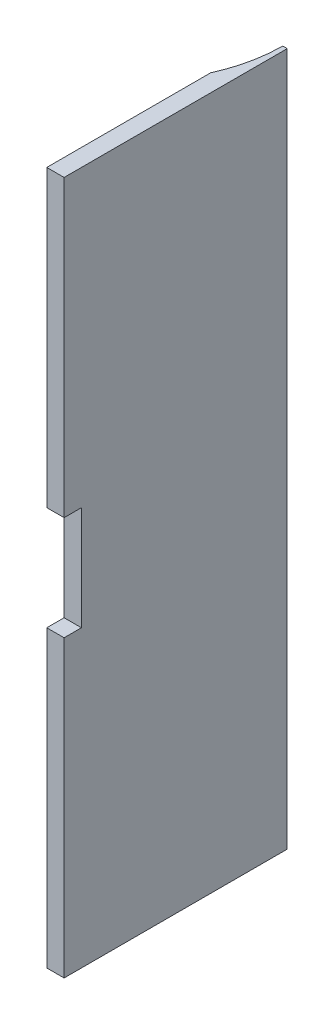
ISO-10303-21;
HEADER;
FILE_DESCRIPTION(('STEP AP214'),'2;1');
FILE_NAME('part.step','',(''),(''),'','','');
FILE_SCHEMA(('AUTOMOTIVE_DESIGN { 1 0 10303 214 1 1 1 1 }'));
ENDSEC;
DATA;
#1=APPLICATION_CONTEXT('core data for automotive mechanical design processes');
#2=APPLICATION_PROTOCOL_DEFINITION('international standard','automotive_design',2000,#1);
#3=PRODUCT_CONTEXT('',#1,'mechanical');
#4=PRODUCT('Part','Part','',(#3));
#5=PRODUCT_RELATED_PRODUCT_CATEGORY('part','',(#4));
#6=PRODUCT_DEFINITION_FORMATION('','',#4);
#7=PRODUCT_DEFINITION_CONTEXT('part definition',#1,'design');
#8=PRODUCT_DEFINITION('design','',#6,#7);
#9=PRODUCT_DEFINITION_SHAPE('','',#8);
#10=(LENGTH_UNIT() NAMED_UNIT(*) SI_UNIT(.MILLI.,.METRE.));
#11=(NAMED_UNIT(*) PLANE_ANGLE_UNIT() SI_UNIT($,.RADIAN.));
#12=(NAMED_UNIT(*) SI_UNIT($,.STERADIAN.) SOLID_ANGLE_UNIT());
#13=UNCERTAINTY_MEASURE_WITH_UNIT(LENGTH_MEASURE(1.E-05),#10,'distance_accuracy_value','');
#14=(GEOMETRIC_REPRESENTATION_CONTEXT(3) GLOBAL_UNCERTAINTY_ASSIGNED_CONTEXT((#13)) GLOBAL_UNIT_ASSIGNED_CONTEXT((#10,
#11,#12)) REPRESENTATION_CONTEXT('',''));
#15=CARTESIAN_POINT('',(0.,0.,0.));
#16=DIRECTION('',(0.,0.,1.));
#17=DIRECTION('',(1.,0.,0.));
#18=AXIS2_PLACEMENT_3D('',#15,#16,#17);
#19=CARTESIAN_POINT('',(0.,0.,0.));
#20=DIRECTION('',(-1.,0.,0.));
#21=DIRECTION('',(0.,0.,1.));
#22=AXIS2_PLACEMENT_3D('',#19,#20,#21);
#23=PLANE('',#22);
#24=DIRECTION('',(0.,0.,1.));
#25=VECTOR('',#24,1.);
#26=CARTESIAN_POINT('',(0.,31.75,12.7));
#27=LINE('',#26,#25);
#28=CARTESIAN_POINT('',(0.,31.75,-2.31951898512119));
#29=VERTEX_POINT('',#28);
#30=CARTESIAN_POINT('',(0.,31.75,12.7));
#31=VERTEX_POINT('',#30);
#32=EDGE_CURVE('E247',#29,#31,#27,.T.);
#33=ORIENTED_EDGE('',*,*,#32,.F.);
#34=CARTESIAN_POINT('',(0.,96.5932028494407,-2.32072648393354));
#35=CARTESIAN_POINT('',(0.,87.8725361842865,-2.32056406735104));
#36=CARTESIAN_POINT('',(0.,79.1518695191321,-2.32040165958585));
#37=CARTESIAN_POINT('',(0.,35.5485361933593,-2.31958966483459));
#38=CARTESIAN_POINT('',(0.,0.665869532738519,-2.31894021007255));
#39=CARTESIAN_POINT('',(0.,-55.0089323684026,-2.31790386667254));
#40=CARTESIAN_POINT('',(0.,-75.8010676089211,-2.31751688720287));
#41=CARTESIAN_POINT('',(0.,-96.5932028494407,-2.31712995775625));
#42=B_SPLINE_CURVE_WITH_KNOTS('',3,(#34,#35,#36,#37,#38,#39,#40,#41),.UNSPECIFIED.,.F.,.F.,(4,2,
2,4),(0.,26.162,130.81,193.186405732359),.UNSPECIFIED.);
#43=CARTESIAN_POINT('',(0.,-31.75,-2.31833681395398));
#44=VERTEX_POINT('',#43);
#45=EDGE_CURVE('E285',#29,#44,#42,.T.);
#46=ORIENTED_EDGE('',*,*,#45,.T.);
#47=DIRECTION('',(0.,0.,-1.));
#48=VECTOR('',#47,1.);
#49=CARTESIAN_POINT('',(0.,-31.75,12.7));
#50=LINE('',#49,#48);
#51=CARTESIAN_POINT('',(0.,-31.75,12.7));
#52=VERTEX_POINT('',#51);
#53=EDGE_CURVE('E217',#52,#44,#50,.T.);
#54=ORIENTED_EDGE('',*,*,#53,.F.);
#55=DIRECTION('',(0.,-1.,0.));
#56=VECTOR('',#55,1.);
#57=CARTESIAN_POINT('',(0.,-31.75,12.7));
#58=LINE('',#57,#56);
#59=CARTESIAN_POINT('',(0.,-4.7625,12.7));
#60=VERTEX_POINT('',#59);
#61=EDGE_CURVE('E258',#60,#52,#58,.T.);
#62=ORIENTED_EDGE('',*,*,#61,.F.);
#63=DIRECTION('',(0.,0.,1.));
#64=VECTOR('',#63,1.);
#65=CARTESIAN_POINT('',(0.,-4.76249999999999,0.));
#66=LINE('',#65,#64);
#67=CARTESIAN_POINT('',(0.,-4.7625,11.1125));
#68=VERTEX_POINT('',#67);
#69=EDGE_CURVE('E267',#68,#60,#66,.T.);
#70=ORIENTED_EDGE('',*,*,#69,.F.);
#71=DIRECTION('',(0.,1.,0.));
#72=VECTOR('',#71,1.);
#73=CARTESIAN_POINT('',(0.,0.,11.1125));
#74=LINE('',#73,#72);
#75=CARTESIAN_POINT('',(0.,4.7625,11.1125));
#76=VERTEX_POINT('',#75);
#77=EDGE_CURVE('E269',#68,#76,#74,.T.);
#78=ORIENTED_EDGE('',*,*,#77,.T.);
#79=DIRECTION('',(0.,0.,1.));
#80=VECTOR('',#79,1.);
#81=CARTESIAN_POINT('',(0.,4.7625,0.));
#82=LINE('',#81,#80);
#83=CARTESIAN_POINT('',(0.,4.7625,12.7));
#84=VERTEX_POINT('',#83);
#85=EDGE_CURVE('E147',#76,#84,#82,.T.);
#86=ORIENTED_EDGE('',*,*,#85,.T.);
#87=EDGE_CURVE('E259',#31,#84,#58,.T.);
#88=ORIENTED_EDGE('',*,*,#87,.F.);
#89=EDGE_LOOP('',(#33,#46,#54,#62,#70,#78,#86,#88));
#90=FACE_BOUND('',#89,.T.);
#91=ADVANCED_FACE('F139',(#90),#23,.T.);
#92=CARTESIAN_POINT('',(0.,31.75,-7.73683999999999));
#93=DIRECTION('',(0.,0.,1.));
#94=DIRECTION('',(0.,-1.,0.));
#95=AXIS2_PLACEMENT_3D('',#92,#93,#94);
#96=PLANE('',#95);
#97=DIRECTION('',(-8.47156396997784E-06,0.999999999964116,0.));
#98=VECTOR('',#97,1.);
#99=CARTESIAN_POINT('',(1.17610392171067,-159.819501060456,-7.73684000000001));
#100=LINE('',#99,#98);
#101=CARTESIAN_POINT('',(1.17448102842768,31.75,-7.7368400000017));
#102=VERTEX_POINT('',#101);
#103=CARTESIAN_POINT('',(1.17501897273979,-31.75,-7.73684000000114));
#104=VERTEX_POINT('',#103);
#105=EDGE_CURVE('E12',#102,#104,#100,.F.);
#106=ORIENTED_EDGE('',*,*,#105,.F.);
#107=DIRECTION('',(1.,0.,0.));
#108=VECTOR('',#107,1.);
#109=CARTESIAN_POINT('',(0.,31.75,-7.73683999999999));
#110=LINE('',#109,#108);
#111=CARTESIAN_POINT('',(1.5875,31.75,-7.73683999999999));
#112=VERTEX_POINT('',#111);
#113=EDGE_CURVE('E224',#102,#112,#110,.T.);
#114=ORIENTED_EDGE('',*,*,#113,.T.);
#115=DIRECTION('',(0.,-1.,0.));
#116=VECTOR('',#115,1.);
#117=CARTESIAN_POINT('',(1.5875,31.75,-7.73683999999999));
#118=LINE('',#117,#116);
#119=CARTESIAN_POINT('',(1.5875,-31.75,-7.73684));
#120=VERTEX_POINT('',#119);
#121=EDGE_CURVE('E221',#112,#120,#118,.T.);
#122=ORIENTED_EDGE('',*,*,#121,.T.);
#123=DIRECTION('',(1.,0.,0.));
#124=VECTOR('',#123,1.);
#125=CARTESIAN_POINT('',(0.,-31.75,-7.73684));
#126=LINE('',#125,#124);
#127=EDGE_CURVE('E161',#104,#120,#126,.T.);
#128=ORIENTED_EDGE('',*,*,#127,.F.);
#129=EDGE_LOOP('',(#106,#114,#122,#128));
#130=FACE_BOUND('',#129,.T.);
#131=ADVANCED_FACE('F219',(#130),#96,.F.);
#132=CARTESIAN_POINT('',(1.5875,-31.75,12.7));
#133=DIRECTION('',(0.,0.,-1.));
#134=DIRECTION('',(-1.,0.,0.));
#135=AXIS2_PLACEMENT_3D('',#132,#133,#134);
#136=PLANE('',#135);
#137=DIRECTION('',(1.,0.,0.));
#138=VECTOR('',#137,1.);
#139=CARTESIAN_POINT('',(-1.5875,4.7625,12.7));
#140=LINE('',#139,#138);
#141=CARTESIAN_POINT('',(1.5875,4.7625,12.7));
#142=VERTEX_POINT('',#141);
#143=EDGE_CURVE('E238',#84,#142,#140,.T.);
#144=ORIENTED_EDGE('',*,*,#143,.T.);
#145=DIRECTION('',(0.,-1.,0.));
#146=VECTOR('',#145,1.);
#147=CARTESIAN_POINT('',(1.5875,-31.75,12.7));
#148=LINE('',#147,#146);
#149=CARTESIAN_POINT('',(1.5875,31.75,12.7));
#150=VERTEX_POINT('',#149);
#151=EDGE_CURVE('E251',#150,#142,#148,.T.);
#152=ORIENTED_EDGE('',*,*,#151,.F.);
#153=DIRECTION('',(-1.,0.,0.));
#154=VECTOR('',#153,1.);
#155=CARTESIAN_POINT('',(1.5875,31.75,12.7));
#156=LINE('',#155,#154);
#157=EDGE_CURVE('E264',#150,#31,#156,.T.);
#158=ORIENTED_EDGE('',*,*,#157,.T.);
#159=ORIENTED_EDGE('',*,*,#87,.T.);
#160=EDGE_LOOP('',(#144,#152,#158,#159));
#161=FACE_BOUND('',#160,.T.);
#162=ADVANCED_FACE('F280',(#161),#136,.F.);
#163=CARTESIAN_POINT('',(1.5875,0.,0.));
#164=DIRECTION('',(-1.,0.,0.));
#165=DIRECTION('',(0.,0.,1.));
#166=AXIS2_PLACEMENT_3D('',#163,#164,#165);
#167=PLANE('',#166);
#168=DIRECTION('',(0.,0.,-1.));
#169=VECTOR('',#168,1.);
#170=CARTESIAN_POINT('',(1.5875,-31.75,12.7));
#171=LINE('',#170,#169);
#172=CARTESIAN_POINT('',(1.5875,-31.75,12.7));
#173=VERTEX_POINT('',#172);
#174=EDGE_CURVE('E254',#173,#120,#171,.T.);
#175=ORIENTED_EDGE('',*,*,#174,.T.);
#176=ORIENTED_EDGE('',*,*,#121,.F.);
#177=DIRECTION('',(0.,0.,1.));
#178=VECTOR('',#177,1.);
#179=CARTESIAN_POINT('',(1.5875,31.75,12.7));
#180=LINE('',#179,#178);
#181=EDGE_CURVE('E248',#112,#150,#180,.T.);
#182=ORIENTED_EDGE('',*,*,#181,.T.);
#183=ORIENTED_EDGE('',*,*,#151,.T.);
#184=DIRECTION('',(0.,0.,-1.));
#185=VECTOR('',#184,1.);
#186=CARTESIAN_POINT('',(1.5875,4.7625,12.7));
#187=LINE('',#186,#185);
#188=CARTESIAN_POINT('',(1.5875,4.7625,11.1125));
#189=VERTEX_POINT('',#188);
#190=EDGE_CURVE('E223',#142,#189,#187,.T.);
#191=ORIENTED_EDGE('',*,*,#190,.T.);
#192=DIRECTION('',(0.,-1.,0.));
#193=VECTOR('',#192,1.);
#194=CARTESIAN_POINT('',(1.5875,4.7625,11.1125));
#195=LINE('',#194,#193);
#196=CARTESIAN_POINT('',(1.5875,-4.7625,11.1125));
#197=VERTEX_POINT('',#196);
#198=EDGE_CURVE('E227',#189,#197,#195,.T.);
#199=ORIENTED_EDGE('',*,*,#198,.T.);
#200=DIRECTION('',(0.,0.,-1.));
#201=VECTOR('',#200,1.);
#202=CARTESIAN_POINT('',(1.5875,-4.7625,12.7));
#203=LINE('',#202,#201);
#204=CARTESIAN_POINT('',(1.5875,-4.7625,12.7));
#205=VERTEX_POINT('',#204);
#206=EDGE_CURVE('E235',#205,#197,#203,.T.);
#207=ORIENTED_EDGE('',*,*,#206,.F.);
#208=EDGE_CURVE('E250',#205,#173,#148,.T.);
#209=ORIENTED_EDGE('',*,*,#208,.T.);
#210=EDGE_LOOP('',(#175,#176,#182,#183,#191,#199,#207,#209));
#211=FACE_BOUND('',#210,.T.);
#212=ADVANCED_FACE('F312',(#211),#167,.F.);
#213=CARTESIAN_POINT('',(1.5875,31.75,12.7));
#214=DIRECTION('',(0.,-1.,0.));
#215=DIRECTION('',(0.,0.,-1.));
#216=AXIS2_PLACEMENT_3D('',#213,#214,#215);
#217=PLANE('',#216);
#218=CARTESIAN_POINT('',(-11.9065189720417,31.75,-7.73684000003112));
#219=DIRECTION('',(0.,-1.,0.));
#220=DIRECTION('',(-1.,0.,-2.09177610096981E-09));
#221=AXIS2_PLACEMENT_3D('',#218,#219,#220);
#222=ELLIPSE('',#221,13.0810000004694,13.081);
#223=EDGE_CURVE('E153',#29,#102,#222,.F.);
#224=ORIENTED_EDGE('',*,*,#223,.F.);
#225=ORIENTED_EDGE('',*,*,#32,.T.);
#226=ORIENTED_EDGE('',*,*,#157,.F.);
#227=ORIENTED_EDGE('',*,*,#181,.F.);
#228=ORIENTED_EDGE('',*,*,#113,.F.);
#229=EDGE_LOOP('',(#224,#225,#226,#227,#228));
#230=FACE_BOUND('',#229,.T.);
#231=ADVANCED_FACE('F141',(#230),#217,.F.);
#232=ORIENTED_EDGE('',*,*,#208,.F.);
#233=DIRECTION('',(1.,0.,0.));
#234=VECTOR('',#233,1.);
#235=CARTESIAN_POINT('',(-1.5875,-4.7625,12.7));
#236=LINE('',#235,#234);
#237=EDGE_CURVE('E241',#60,#205,#236,.T.);
#238=ORIENTED_EDGE('',*,*,#237,.F.);
#239=ORIENTED_EDGE('',*,*,#61,.T.);
#240=DIRECTION('',(-1.,0.,0.));
#241=VECTOR('',#240,1.);
#242=CARTESIAN_POINT('',(1.5875,-31.75,12.7));
#243=LINE('',#242,#241);
#244=EDGE_CURVE('E256',#173,#52,#243,.T.);
#245=ORIENTED_EDGE('',*,*,#244,.F.);
#246=EDGE_LOOP('',(#232,#238,#239,#245));
#247=FACE_BOUND('',#246,.T.);
#248=ADVANCED_FACE('F319',(#247),#136,.F.);
#249=CARTESIAN_POINT('',(1.5875,-31.75,12.7));
#250=DIRECTION('',(0.,1.,0.));
#251=DIRECTION('',(0.,0.,1.));
#252=AXIS2_PLACEMENT_3D('',#249,#250,#251);
#253=PLANE('',#252);
#254=CARTESIAN_POINT('',(-11.9059810277296,-31.75,-7.73684000002999));
#255=DIRECTION('',(0.,1.,0.));
#256=DIRECTION('',(-1.,0.,-2.09177610096981E-09));
#257=AXIS2_PLACEMENT_3D('',#254,#255,#256);
#258=ELLIPSE('',#257,13.0810000004694,13.081);
#259=EDGE_CURVE('E209',#104,#44,#258,.F.);
#260=ORIENTED_EDGE('',*,*,#259,.F.);
#261=ORIENTED_EDGE('',*,*,#127,.T.);
#262=ORIENTED_EDGE('',*,*,#174,.F.);
#263=ORIENTED_EDGE('',*,*,#244,.T.);
#264=ORIENTED_EDGE('',*,*,#53,.T.);
#265=EDGE_LOOP('',(#260,#261,#262,#263,#264));
#266=FACE_BOUND('',#265,.T.);
#267=ADVANCED_FACE('F214',(#266),#253,.F.);
#268=CARTESIAN_POINT('',(-1.5875,4.7625,12.7));
#269=DIRECTION('',(0.,-1.,0.));
#270=DIRECTION('',(0.,0.,-1.));
#271=AXIS2_PLACEMENT_3D('',#268,#269,#270);
#272=PLANE('',#271);
#273=DIRECTION('',(1.,0.,0.));
#274=VECTOR('',#273,1.);
#275=CARTESIAN_POINT('',(-1.5875,4.7625,11.1125));
#276=LINE('',#275,#274);
#277=EDGE_CURVE('E245',#76,#189,#276,.T.);
#278=ORIENTED_EDGE('',*,*,#277,.T.);
#279=ORIENTED_EDGE('',*,*,#190,.F.);
#280=ORIENTED_EDGE('',*,*,#143,.F.);
#281=ORIENTED_EDGE('',*,*,#85,.F.);
#282=EDGE_LOOP('',(#278,#279,#280,#281));
#283=FACE_BOUND('',#282,.T.);
#284=ADVANCED_FACE('F309',(#283),#272,.T.);
#285=CARTESIAN_POINT('',(-1.5875,4.7625,11.1125));
#286=DIRECTION('',(0.,0.,1.));
#287=DIRECTION('',(1.,0.,0.));
#288=AXIS2_PLACEMENT_3D('',#285,#286,#287);
#289=PLANE('',#288);
#290=DIRECTION('',(1.,0.,0.));
#291=VECTOR('',#290,1.);
#292=CARTESIAN_POINT('',(-1.5875,-4.7625,11.1125));
#293=LINE('',#292,#291);
#294=EDGE_CURVE('E243',#68,#197,#293,.T.);
#295=ORIENTED_EDGE('',*,*,#294,.T.);
#296=ORIENTED_EDGE('',*,*,#198,.F.);
#297=ORIENTED_EDGE('',*,*,#277,.F.);
#298=ORIENTED_EDGE('',*,*,#77,.F.);
#299=EDGE_LOOP('',(#295,#296,#297,#298));
#300=FACE_BOUND('',#299,.T.);
#301=ADVANCED_FACE('F305',(#300),#289,.T.);
#302=CARTESIAN_POINT('',(-1.5875,-4.7625,12.7));
#303=DIRECTION('',(0.,-1.,0.));
#304=DIRECTION('',(0.,0.,-1.));
#305=AXIS2_PLACEMENT_3D('',#302,#303,#304);
#306=PLANE('',#305);
#307=ORIENTED_EDGE('',*,*,#69,.T.);
#308=ORIENTED_EDGE('',*,*,#237,.T.);
#309=ORIENTED_EDGE('',*,*,#206,.T.);
#310=ORIENTED_EDGE('',*,*,#294,.F.);
#311=EDGE_LOOP('',(#307,#308,#309,#310));
#312=FACE_BOUND('',#311,.T.);
#313=ADVANCED_FACE('F300',(#312),#306,.F.);
#314=CARTESIAN_POINT('',(-11.9048960778199,-159.819611876984,-7.73684000002772));
#315=DIRECTION('',(-8.47156396997784E-06,0.999999999964116,0.));
#316=DIRECTION('',(0.999999999964116,8.47156397019988E-06,-1.52359444941307E-13));
#317=AXIS2_PLACEMENT_3D('',#314,#315,#316);
#318=CYLINDRICAL_SURFACE('',#317,13.081);
#319=ORIENTED_EDGE('',*,*,#223,.T.);
#320=ORIENTED_EDGE('',*,*,#105,.T.);
#321=ORIENTED_EDGE('',*,*,#259,.T.);
#322=ORIENTED_EDGE('',*,*,#45,.F.);
#323=EDGE_LOOP('',(#319,#320,#321,#322));
#324=FACE_BOUND('',#323,.T.);
#325=ADVANCED_FACE('F208',(#324),#318,.F.);
#326=CLOSED_SHELL('',(#91,#131,#162,#212,#231,#248,#267,#284,#301,#313,#325));
#327=MANIFOLD_SOLID_BREP('B2',#326);
#328=ADVANCED_BREP_SHAPE_REPRESENTATION('',(#18,#327),#14);
#329=SHAPE_DEFINITION_REPRESENTATION(#9,#328);
ENDSEC;
END-ISO-10303-21;
